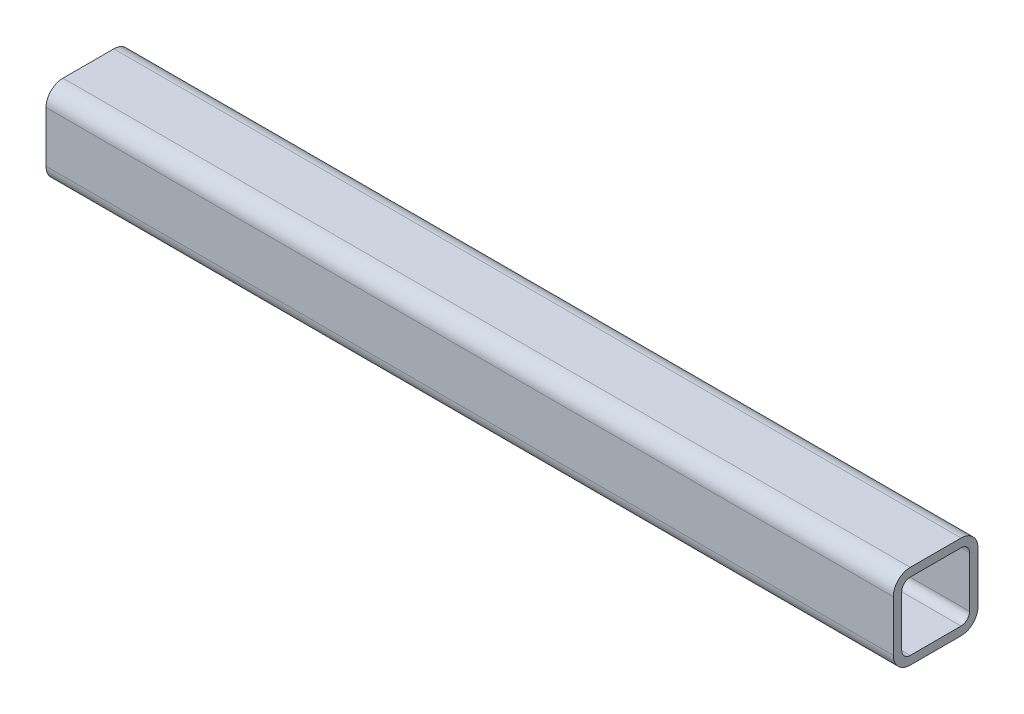
ISO-10303-21;
HEADER;
FILE_DESCRIPTION(('STEP AP214'),'2;1');
FILE_NAME('part.step','',(''),(''),'','','');
FILE_SCHEMA(('AUTOMOTIVE_DESIGN { 1 0 10303 214 1 1 1 1 }'));
ENDSEC;
DATA;
#1=APPLICATION_CONTEXT('core data for automotive mechanical design processes');
#2=APPLICATION_PROTOCOL_DEFINITION('international standard','automotive_design',2000,#1);
#3=PRODUCT_CONTEXT('',#1,'mechanical');
#4=PRODUCT('Part','Part','',(#3));
#5=PRODUCT_RELATED_PRODUCT_CATEGORY('part','',(#4));
#6=PRODUCT_DEFINITION_FORMATION('','',#4);
#7=PRODUCT_DEFINITION_CONTEXT('part definition',#1,'design');
#8=PRODUCT_DEFINITION('design','',#6,#7);
#9=PRODUCT_DEFINITION_SHAPE('','',#8);
#10=(LENGTH_UNIT() NAMED_UNIT(*) SI_UNIT(.MILLI.,.METRE.));
#11=(NAMED_UNIT(*) PLANE_ANGLE_UNIT() SI_UNIT($,.RADIAN.));
#12=(NAMED_UNIT(*) SI_UNIT($,.STERADIAN.) SOLID_ANGLE_UNIT());
#13=UNCERTAINTY_MEASURE_WITH_UNIT(LENGTH_MEASURE(1.E-05),#10,'distance_accuracy_value','');
#14=(GEOMETRIC_REPRESENTATION_CONTEXT(3) GLOBAL_UNCERTAINTY_ASSIGNED_CONTEXT((#13)) GLOBAL_UNIT_ASSIGNED_CONTEXT((#10,
#11,#12)) REPRESENTATION_CONTEXT('',''));
#15=CARTESIAN_POINT('',(0.,0.,0.));
#16=DIRECTION('',(0.,0.,1.));
#17=DIRECTION('',(1.,0.,0.));
#18=AXIS2_PLACEMENT_3D('',#15,#16,#17);
#19=CARTESIAN_POINT('',(99.9999999999993,-80.0000000000002,-559.));
#20=DIRECTION('',(1.,0.,0.));
#21=DIRECTION('',(0.,0.,-1.));
#22=AXIS2_PLACEMENT_3D('',#19,#20,#21);
#23=PLANE('',#22);
#24=DIRECTION('',(0.,1.,0.));
#25=VECTOR('',#24,1.);
#26=CARTESIAN_POINT('',(99.9999999999993,-86.,-560.));
#27=LINE('',#26,#25);
#28=CARTESIAN_POINT('',(99.9999999999993,-86.0000000000005,-560.));
#29=VERTEX_POINT('',#28);
#30=CARTESIAN_POINT('',(99.9999999999993,-74.0000000000005,-560.));
#31=VERTEX_POINT('',#30);
#32=EDGE_CURVE('E11',#29,#31,#27,.T.);
#33=ORIENTED_EDGE('',*,*,#32,.T.);
#34=CARTESIAN_POINT('',(99.9999999999993,-74.,-556.));
#35=DIRECTION('',(1.,0.,0.));
#36=DIRECTION('',(0.,0.,-1.));
#37=AXIS2_PLACEMENT_3D('',#34,#35,#36);
#38=CIRCLE('',#37,4.);
#39=CARTESIAN_POINT('',(99.9999999999993,-70.,-556.));
#40=VERTEX_POINT('',#39);
#41=EDGE_CURVE('E249',#31,#40,#38,.T.);
#42=ORIENTED_EDGE('',*,*,#41,.T.);
#43=DIRECTION('',(0.,0.,1.));
#44=VECTOR('',#43,1.);
#45=CARTESIAN_POINT('',(99.9999999999993,-70.,-544.));
#46=LINE('',#45,#44);
#47=CARTESIAN_POINT('',(99.9999999999993,-70.,-544.));
#48=VERTEX_POINT('',#47);
#49=EDGE_CURVE('E246',#40,#48,#46,.T.);
#50=ORIENTED_EDGE('',*,*,#49,.T.);
#51=CARTESIAN_POINT('',(99.9999999999993,-74.,-544.));
#52=DIRECTION('',(1.,0.,0.));
#53=DIRECTION('',(0.,0.,-1.));
#54=AXIS2_PLACEMENT_3D('',#51,#52,#53);
#55=CIRCLE('',#54,4.);
#56=CARTESIAN_POINT('',(99.9999999999993,-74.,-540.));
#57=VERTEX_POINT('',#56);
#58=EDGE_CURVE('E243',#48,#57,#55,.T.);
#59=ORIENTED_EDGE('',*,*,#58,.T.);
#60=DIRECTION('',(0.,-1.,0.));
#61=VECTOR('',#60,1.);
#62=CARTESIAN_POINT('',(99.9999999999993,-74.,-540.));
#63=LINE('',#62,#61);
#64=CARTESIAN_POINT('',(99.9999999999993,-86.,-540.));
#65=VERTEX_POINT('',#64);
#66=EDGE_CURVE('E240',#57,#65,#63,.T.);
#67=ORIENTED_EDGE('',*,*,#66,.T.);
#68=CARTESIAN_POINT('',(99.9999999999993,-86.,-544.));
#69=DIRECTION('',(1.,0.,0.));
#70=DIRECTION('',(0.,0.,-1.));
#71=AXIS2_PLACEMENT_3D('',#68,#69,#70);
#72=CIRCLE('',#71,4.);
#73=CARTESIAN_POINT('',(99.9999999999993,-90.,-544.));
#74=VERTEX_POINT('',#73);
#75=EDGE_CURVE('E237',#65,#74,#72,.T.);
#76=ORIENTED_EDGE('',*,*,#75,.T.);
#77=DIRECTION('',(0.,0.,-1.));
#78=VECTOR('',#77,1.);
#79=CARTESIAN_POINT('',(99.9999999999993,-90.,-556.));
#80=LINE('',#79,#78);
#81=CARTESIAN_POINT('',(99.9999999999993,-90.,-556.));
#82=VERTEX_POINT('',#81);
#83=EDGE_CURVE('E234',#74,#82,#80,.T.);
#84=ORIENTED_EDGE('',*,*,#83,.T.);
#85=CARTESIAN_POINT('',(99.9999999999993,-86.,-556.));
#86=DIRECTION('',(1.,0.,0.));
#87=DIRECTION('',(0.,0.,-1.));
#88=AXIS2_PLACEMENT_3D('',#85,#86,#87);
#89=CIRCLE('',#88,4.);
#90=EDGE_CURVE('E185',#82,#29,#89,.T.);
#91=ORIENTED_EDGE('',*,*,#90,.T.);
#92=EDGE_LOOP('',(#33,#42,#50,#59,#67,#76,#84,#91));
#93=FACE_BOUND('',#92,.T.);
#94=CARTESIAN_POINT('',(99.9999999999993,-74.,-556.));
#95=DIRECTION('',(1.,0.,0.));
#96=DIRECTION('',(0.,0.,-1.));
#97=AXIS2_PLACEMENT_3D('',#94,#95,#96);
#98=CIRCLE('',#97,2.);
#99=CARTESIAN_POINT('',(99.9999999999993,-74.,-558.));
#100=VERTEX_POINT('',#99);
#101=CARTESIAN_POINT('',(99.9999999999993,-72.,-556.));
#102=VERTEX_POINT('',#101);
#103=EDGE_CURVE('E217',#100,#102,#98,.T.);
#104=ORIENTED_EDGE('',*,*,#103,.F.);
#105=DIRECTION('',(0.,1.,0.));
#106=VECTOR('',#105,1.);
#107=CARTESIAN_POINT('',(99.9999999999993,-86.,-558.));
#108=LINE('',#107,#106);
#109=CARTESIAN_POINT('',(99.9999999999993,-86.0000000000005,-558.));
#110=VERTEX_POINT('',#109);
#111=EDGE_CURVE('E173',#110,#100,#108,.T.);
#112=ORIENTED_EDGE('',*,*,#111,.F.);
#113=CARTESIAN_POINT('',(99.9999999999993,-86.,-556.));
#114=DIRECTION('',(1.,0.,0.));
#115=DIRECTION('',(0.,0.,-1.));
#116=AXIS2_PLACEMENT_3D('',#113,#114,#115);
#117=CIRCLE('',#116,2.);
#118=CARTESIAN_POINT('',(99.9999999999993,-88.,-556.));
#119=VERTEX_POINT('',#118);
#120=EDGE_CURVE('E70',#119,#110,#117,.T.);
#121=ORIENTED_EDGE('',*,*,#120,.F.);
#122=DIRECTION('',(0.,0.,-1.));
#123=VECTOR('',#122,1.);
#124=CARTESIAN_POINT('',(99.9999999999993,-88.,-556.));
#125=LINE('',#124,#123);
#126=CARTESIAN_POINT('',(99.9999999999993,-88.,-544.));
#127=VERTEX_POINT('',#126);
#128=EDGE_CURVE('E82',#127,#119,#125,.T.);
#129=ORIENTED_EDGE('',*,*,#128,.F.);
#130=CARTESIAN_POINT('',(99.9999999999993,-86.,-544.));
#131=DIRECTION('',(1.,0.,0.));
#132=DIRECTION('',(0.,0.,-1.));
#133=AXIS2_PLACEMENT_3D('',#130,#131,#132);
#134=CIRCLE('',#133,2.);
#135=CARTESIAN_POINT('',(99.9999999999993,-86.,-542.));
#136=VERTEX_POINT('',#135);
#137=EDGE_CURVE('E222',#136,#127,#134,.T.);
#138=ORIENTED_EDGE('',*,*,#137,.F.);
#139=DIRECTION('',(0.,-1.,0.));
#140=VECTOR('',#139,1.);
#141=CARTESIAN_POINT('',(99.9999999999993,-74.,-542.));
#142=LINE('',#141,#140);
#143=CARTESIAN_POINT('',(99.9999999999993,-74.,-542.));
#144=VERTEX_POINT('',#143);
#145=EDGE_CURVE('E212',#144,#136,#142,.T.);
#146=ORIENTED_EDGE('',*,*,#145,.F.);
#147=CARTESIAN_POINT('',(99.9999999999993,-74.,-544.));
#148=DIRECTION('',(1.,0.,0.));
#149=DIRECTION('',(0.,0.,-1.));
#150=AXIS2_PLACEMENT_3D('',#147,#148,#149);
#151=CIRCLE('',#150,2.);
#152=CARTESIAN_POINT('',(99.9999999999993,-72.,-544.));
#153=VERTEX_POINT('',#152);
#154=EDGE_CURVE('E209',#153,#144,#151,.T.);
#155=ORIENTED_EDGE('',*,*,#154,.F.);
#156=DIRECTION('',(0.,0.,1.));
#157=VECTOR('',#156,1.);
#158=CARTESIAN_POINT('',(99.9999999999993,-72.,-544.));
#159=LINE('',#158,#157);
#160=EDGE_CURVE('E204',#102,#153,#159,.T.);
#161=ORIENTED_EDGE('',*,*,#160,.F.);
#162=EDGE_LOOP('',(#104,#112,#121,#129,#138,#146,#155,#161));
#163=FACE_BOUND('',#162,.T.);
#164=ADVANCED_FACE('F41',(#93,#163),#23,.T.);
#165=CARTESIAN_POINT('',(-100.,-74.0000000000004,-550.));
#166=DIRECTION('',(-1.,0.,0.));
#167=DIRECTION('',(0.,0.,1.));
#168=AXIS2_PLACEMENT_3D('',#165,#166,#167);
#169=PLANE('',#168);
#170=CARTESIAN_POINT('',(-100.,-74.,-556.));
#171=DIRECTION('',(-1.,0.,0.));
#172=DIRECTION('',(0.,0.,1.));
#173=AXIS2_PLACEMENT_3D('',#170,#171,#172);
#174=CIRCLE('',#173,4.);
#175=CARTESIAN_POINT('',(-100.,-70.,-556.));
#176=VERTEX_POINT('',#175);
#177=CARTESIAN_POINT('',(-100.,-74.0000000000004,-560.));
#178=VERTEX_POINT('',#177);
#179=EDGE_CURVE('E190',#176,#178,#174,.T.);
#180=ORIENTED_EDGE('',*,*,#179,.T.);
#181=DIRECTION('',(0.,-1.,0.));
#182=VECTOR('',#181,1.);
#183=CARTESIAN_POINT('',(-100.,-86.,-560.));
#184=LINE('',#183,#182);
#185=CARTESIAN_POINT('',(-100.,-86.0000000000004,-560.));
#186=VERTEX_POINT('',#185);
#187=EDGE_CURVE('E182',#178,#186,#184,.T.);
#188=ORIENTED_EDGE('',*,*,#187,.T.);
#189=CARTESIAN_POINT('',(-100.,-86.,-556.));
#190=DIRECTION('',(-1.,0.,0.));
#191=DIRECTION('',(0.,0.,1.));
#192=AXIS2_PLACEMENT_3D('',#189,#190,#191);
#193=CIRCLE('',#192,4.);
#194=CARTESIAN_POINT('',(-100.,-90.,-556.));
#195=VERTEX_POINT('',#194);
#196=EDGE_CURVE('E192',#186,#195,#193,.T.);
#197=ORIENTED_EDGE('',*,*,#196,.T.);
#198=DIRECTION('',(0.,0.,1.));
#199=VECTOR('',#198,1.);
#200=CARTESIAN_POINT('',(-100.,-90.,-556.));
#201=LINE('',#200,#199);
#202=CARTESIAN_POINT('',(-100.,-90.,-544.));
#203=VERTEX_POINT('',#202);
#204=EDGE_CURVE('E194',#195,#203,#201,.T.);
#205=ORIENTED_EDGE('',*,*,#204,.T.);
#206=CARTESIAN_POINT('',(-100.,-86.,-544.));
#207=DIRECTION('',(-1.,0.,0.));
#208=DIRECTION('',(0.,0.,1.));
#209=AXIS2_PLACEMENT_3D('',#206,#207,#208);
#210=CIRCLE('',#209,4.);
#211=CARTESIAN_POINT('',(-100.,-86.,-540.));
#212=VERTEX_POINT('',#211);
#213=EDGE_CURVE('E196',#203,#212,#210,.T.);
#214=ORIENTED_EDGE('',*,*,#213,.T.);
#215=DIRECTION('',(0.,1.,0.));
#216=VECTOR('',#215,1.);
#217=CARTESIAN_POINT('',(-100.,-74.,-540.));
#218=LINE('',#217,#216);
#219=CARTESIAN_POINT('',(-100.,-74.,-540.));
#220=VERTEX_POINT('',#219);
#221=EDGE_CURVE('E184',#212,#220,#218,.T.);
#222=ORIENTED_EDGE('',*,*,#221,.T.);
#223=CARTESIAN_POINT('',(-100.,-74.,-544.));
#224=DIRECTION('',(-1.,0.,0.));
#225=DIRECTION('',(0.,0.,1.));
#226=AXIS2_PLACEMENT_3D('',#223,#224,#225);
#227=CIRCLE('',#226,4.);
#228=CARTESIAN_POINT('',(-100.,-70.,-544.));
#229=VERTEX_POINT('',#228);
#230=EDGE_CURVE('E186',#220,#229,#227,.T.);
#231=ORIENTED_EDGE('',*,*,#230,.T.);
#232=DIRECTION('',(0.,0.,-1.));
#233=VECTOR('',#232,1.);
#234=CARTESIAN_POINT('',(-100.,-70.,-544.));
#235=LINE('',#234,#233);
#236=EDGE_CURVE('E188',#229,#176,#235,.T.);
#237=ORIENTED_EDGE('',*,*,#236,.T.);
#238=EDGE_LOOP('',(#180,#188,#197,#205,#214,#222,#231,#237));
#239=FACE_BOUND('',#238,.T.);
#240=DIRECTION('',(0.,-1.,0.));
#241=VECTOR('',#240,1.);
#242=CARTESIAN_POINT('',(-100.,-86.,-558.));
#243=LINE('',#242,#241);
#244=CARTESIAN_POINT('',(-100.,-74.0000000000004,-558.));
#245=VERTEX_POINT('',#244);
#246=CARTESIAN_POINT('',(-100.,-86.,-558.));
#247=VERTEX_POINT('',#246);
#248=EDGE_CURVE('E163',#245,#247,#243,.T.);
#249=ORIENTED_EDGE('',*,*,#248,.F.);
#250=CARTESIAN_POINT('',(-100.,-74.,-556.));
#251=DIRECTION('',(-1.,0.,0.));
#252=DIRECTION('',(0.,0.,1.));
#253=AXIS2_PLACEMENT_3D('',#250,#251,#252);
#254=CIRCLE('',#253,2.);
#255=CARTESIAN_POINT('',(-100.,-72.,-556.));
#256=VERTEX_POINT('',#255);
#257=EDGE_CURVE('E213',#256,#245,#254,.T.);
#258=ORIENTED_EDGE('',*,*,#257,.F.);
#259=DIRECTION('',(0.,0.,-1.));
#260=VECTOR('',#259,1.);
#261=CARTESIAN_POINT('',(-100.,-72.,-544.));
#262=LINE('',#261,#260);
#263=CARTESIAN_POINT('',(-100.,-72.,-544.));
#264=VERTEX_POINT('',#263);
#265=EDGE_CURVE('E200',#264,#256,#262,.T.);
#266=ORIENTED_EDGE('',*,*,#265,.F.);
#267=CARTESIAN_POINT('',(-100.,-74.,-544.));
#268=DIRECTION('',(-1.,0.,0.));
#269=DIRECTION('',(0.,0.,1.));
#270=AXIS2_PLACEMENT_3D('',#267,#268,#269);
#271=CIRCLE('',#270,2.);
#272=CARTESIAN_POINT('',(-100.,-74.,-542.));
#273=VERTEX_POINT('',#272);
#274=EDGE_CURVE('E205',#273,#264,#271,.T.);
#275=ORIENTED_EDGE('',*,*,#274,.F.);
#276=DIRECTION('',(0.,1.,0.));
#277=VECTOR('',#276,1.);
#278=CARTESIAN_POINT('',(-100.,-74.,-542.));
#279=LINE('',#278,#277);
#280=CARTESIAN_POINT('',(-100.,-86.,-542.));
#281=VERTEX_POINT('',#280);
#282=EDGE_CURVE('E174',#281,#273,#279,.T.);
#283=ORIENTED_EDGE('',*,*,#282,.F.);
#284=CARTESIAN_POINT('',(-100.,-86.,-544.));
#285=DIRECTION('',(-1.,0.,0.));
#286=DIRECTION('',(0.,0.,1.));
#287=AXIS2_PLACEMENT_3D('',#284,#285,#286);
#288=CIRCLE('',#287,2.);
#289=CARTESIAN_POINT('',(-100.,-88.,-544.));
#290=VERTEX_POINT('',#289);
#291=EDGE_CURVE('E218',#290,#281,#288,.T.);
#292=ORIENTED_EDGE('',*,*,#291,.F.);
#293=DIRECTION('',(0.,0.,1.));
#294=VECTOR('',#293,1.);
#295=CARTESIAN_POINT('',(-100.,-88.,-556.));
#296=LINE('',#295,#294);
#297=CARTESIAN_POINT('',(-100.,-88.,-556.));
#298=VERTEX_POINT('',#297);
#299=EDGE_CURVE('E166',#298,#290,#296,.T.);
#300=ORIENTED_EDGE('',*,*,#299,.F.);
#301=CARTESIAN_POINT('',(-100.,-86.,-556.));
#302=DIRECTION('',(-1.,0.,0.));
#303=DIRECTION('',(0.,0.,1.));
#304=AXIS2_PLACEMENT_3D('',#301,#302,#303);
#305=CIRCLE('',#304,2.);
#306=EDGE_CURVE('E160',#247,#298,#305,.T.);
#307=ORIENTED_EDGE('',*,*,#306,.F.);
#308=EDGE_LOOP('',(#249,#258,#266,#275,#283,#292,#300,#307));
#309=FACE_BOUND('',#308,.T.);
#310=ADVANCED_FACE('F161',(#239,#309),#169,.T.);
#311=CARTESIAN_POINT('',(-110.,-86.,-544.));
#312=DIRECTION('',(1.,0.,0.));
#313=DIRECTION('',(0.,0.,-1.));
#314=AXIS2_PLACEMENT_3D('',#311,#312,#313);
#315=CYLINDRICAL_SURFACE('',#314,2.);
#316=DIRECTION('',(1.,0.,0.));
#317=VECTOR('',#316,1.);
#318=CARTESIAN_POINT('',(-110.,-86.,-542.));
#319=LINE('',#318,#317);
#320=EDGE_CURVE('E198',#281,#136,#319,.T.);
#321=ORIENTED_EDGE('',*,*,#320,.T.);
#322=ORIENTED_EDGE('',*,*,#137,.T.);
#323=DIRECTION('',(1.,0.,0.));
#324=VECTOR('',#323,1.);
#325=CARTESIAN_POINT('',(-110.,-88.,-544.));
#326=LINE('',#325,#324);
#327=EDGE_CURVE('E221',#290,#127,#326,.T.);
#328=ORIENTED_EDGE('',*,*,#327,.F.);
#329=ORIENTED_EDGE('',*,*,#291,.T.);
#330=EDGE_LOOP('',(#321,#322,#328,#329));
#331=FACE_BOUND('',#330,.T.);
#332=ADVANCED_FACE('F299',(#331),#315,.F.);
#333=CARTESIAN_POINT('',(-110.,-88.,-556.));
#334=DIRECTION('',(0.,1.,0.));
#335=DIRECTION('',(0.,0.,1.));
#336=AXIS2_PLACEMENT_3D('',#333,#334,#335);
#337=PLANE('',#336);
#338=ORIENTED_EDGE('',*,*,#327,.T.);
#339=ORIENTED_EDGE('',*,*,#128,.T.);
#340=DIRECTION('',(1.,0.,0.));
#341=VECTOR('',#340,1.);
#342=CARTESIAN_POINT('',(-110.,-88.,-556.));
#343=LINE('',#342,#341);
#344=EDGE_CURVE('E223',#298,#119,#343,.T.);
#345=ORIENTED_EDGE('',*,*,#344,.F.);
#346=ORIENTED_EDGE('',*,*,#299,.T.);
#347=EDGE_LOOP('',(#338,#339,#345,#346));
#348=FACE_BOUND('',#347,.T.);
#349=ADVANCED_FACE('F300',(#348),#337,.T.);
#350=CARTESIAN_POINT('',(-110.,-86.,-556.));
#351=DIRECTION('',(1.,0.,0.));
#352=DIRECTION('',(0.,0.,-1.));
#353=AXIS2_PLACEMENT_3D('',#350,#351,#352);
#354=CYLINDRICAL_SURFACE('',#353,2.);
#355=ORIENTED_EDGE('',*,*,#344,.T.);
#356=ORIENTED_EDGE('',*,*,#120,.T.);
#357=DIRECTION('',(1.,0.,0.));
#358=VECTOR('',#357,1.);
#359=CARTESIAN_POINT('',(-110.,-86.,-558.));
#360=LINE('',#359,#358);
#361=EDGE_CURVE('E169',#247,#110,#360,.T.);
#362=ORIENTED_EDGE('',*,*,#361,.F.);
#363=ORIENTED_EDGE('',*,*,#306,.T.);
#364=EDGE_LOOP('',(#355,#356,#362,#363));
#365=FACE_BOUND('',#364,.T.);
#366=ADVANCED_FACE('F170',(#365),#354,.F.);
#367=CARTESIAN_POINT('',(-110.,-74.,-556.));
#368=DIRECTION('',(1.,0.,0.));
#369=DIRECTION('',(0.,0.,-1.));
#370=AXIS2_PLACEMENT_3D('',#367,#368,#369);
#371=CYLINDRICAL_SURFACE('',#370,2.);
#372=DIRECTION('',(1.,0.,0.));
#373=VECTOR('',#372,1.);
#374=CARTESIAN_POINT('',(-110.,-74.,-558.));
#375=LINE('',#374,#373);
#376=EDGE_CURVE('E44',#245,#100,#375,.T.);
#377=ORIENTED_EDGE('',*,*,#376,.T.);
#378=ORIENTED_EDGE('',*,*,#103,.T.);
#379=DIRECTION('',(1.,0.,0.));
#380=VECTOR('',#379,1.);
#381=CARTESIAN_POINT('',(-110.,-72.,-556.));
#382=LINE('',#381,#380);
#383=EDGE_CURVE('E216',#256,#102,#382,.T.);
#384=ORIENTED_EDGE('',*,*,#383,.F.);
#385=ORIENTED_EDGE('',*,*,#257,.T.);
#386=EDGE_LOOP('',(#377,#378,#384,#385));
#387=FACE_BOUND('',#386,.T.);
#388=ADVANCED_FACE('F286',(#387),#371,.F.);
#389=CARTESIAN_POINT('',(-110.,-72.,-544.));
#390=DIRECTION('',(0.,-1.,0.));
#391=DIRECTION('',(0.,0.,-1.));
#392=AXIS2_PLACEMENT_3D('',#389,#390,#391);
#393=PLANE('',#392);
#394=ORIENTED_EDGE('',*,*,#383,.T.);
#395=ORIENTED_EDGE('',*,*,#160,.T.);
#396=DIRECTION('',(1.,0.,0.));
#397=VECTOR('',#396,1.);
#398=CARTESIAN_POINT('',(-110.,-72.,-544.));
#399=LINE('',#398,#397);
#400=EDGE_CURVE('E203',#264,#153,#399,.T.);
#401=ORIENTED_EDGE('',*,*,#400,.F.);
#402=ORIENTED_EDGE('',*,*,#265,.T.);
#403=EDGE_LOOP('',(#394,#395,#401,#402));
#404=FACE_BOUND('',#403,.T.);
#405=ADVANCED_FACE('F288',(#404),#393,.T.);
#406=CARTESIAN_POINT('',(-110.,-74.,-544.));
#407=DIRECTION('',(1.,0.,0.));
#408=DIRECTION('',(0.,0.,-1.));
#409=AXIS2_PLACEMENT_3D('',#406,#407,#408);
#410=CYLINDRICAL_SURFACE('',#409,2.);
#411=ORIENTED_EDGE('',*,*,#400,.T.);
#412=ORIENTED_EDGE('',*,*,#154,.T.);
#413=DIRECTION('',(1.,0.,0.));
#414=VECTOR('',#413,1.);
#415=CARTESIAN_POINT('',(-110.,-74.,-542.));
#416=LINE('',#415,#414);
#417=EDGE_CURVE('E208',#273,#144,#416,.T.);
#418=ORIENTED_EDGE('',*,*,#417,.F.);
#419=ORIENTED_EDGE('',*,*,#274,.T.);
#420=EDGE_LOOP('',(#411,#412,#418,#419));
#421=FACE_BOUND('',#420,.T.);
#422=ADVANCED_FACE('F293',(#421),#410,.F.);
#423=CARTESIAN_POINT('',(-110.,-74.,-542.));
#424=DIRECTION('',(0.,0.,-1.));
#425=DIRECTION('',(-1.,0.,0.));
#426=AXIS2_PLACEMENT_3D('',#423,#424,#425);
#427=PLANE('',#426);
#428=ORIENTED_EDGE('',*,*,#417,.T.);
#429=ORIENTED_EDGE('',*,*,#145,.T.);
#430=ORIENTED_EDGE('',*,*,#320,.F.);
#431=ORIENTED_EDGE('',*,*,#282,.T.);
#432=EDGE_LOOP('',(#428,#429,#430,#431));
#433=FACE_BOUND('',#432,.T.);
#434=ADVANCED_FACE('F296',(#433),#427,.T.);
#435=CARTESIAN_POINT('',(-110.,-86.,-558.));
#436=DIRECTION('',(0.,0.,1.));
#437=DIRECTION('',(1.,0.,0.));
#438=AXIS2_PLACEMENT_3D('',#435,#436,#437);
#439=PLANE('',#438);
#440=ORIENTED_EDGE('',*,*,#361,.T.);
#441=ORIENTED_EDGE('',*,*,#111,.T.);
#442=ORIENTED_EDGE('',*,*,#376,.F.);
#443=ORIENTED_EDGE('',*,*,#248,.T.);
#444=EDGE_LOOP('',(#440,#441,#442,#443));
#445=FACE_BOUND('',#444,.T.);
#446=ADVANCED_FACE('F175',(#445),#439,.T.);
#447=CARTESIAN_POINT('',(-110.,-86.,-556.));
#448=DIRECTION('',(1.,0.,0.));
#449=DIRECTION('',(0.,0.,-1.));
#450=AXIS2_PLACEMENT_3D('',#447,#448,#449);
#451=CYLINDRICAL_SURFACE('',#450,4.);
#452=ORIENTED_EDGE('',*,*,#90,.F.);
#453=DIRECTION('',(1.,0.,0.));
#454=VECTOR('',#453,1.);
#455=CARTESIAN_POINT('',(-110.,-90.,-556.));
#456=LINE('',#455,#454);
#457=EDGE_CURVE('E256',#195,#82,#456,.T.);
#458=ORIENTED_EDGE('',*,*,#457,.F.);
#459=ORIENTED_EDGE('',*,*,#196,.F.);
#460=DIRECTION('',(1.,0.,0.));
#461=VECTOR('',#460,1.);
#462=CARTESIAN_POINT('',(-110.,-86.,-560.));
#463=LINE('',#462,#461);
#464=EDGE_CURVE('E176',#186,#29,#463,.T.);
#465=ORIENTED_EDGE('',*,*,#464,.T.);
#466=EDGE_LOOP('',(#452,#458,#459,#465));
#467=FACE_BOUND('',#466,.T.);
#468=ADVANCED_FACE('F348',(#467),#451,.T.);
#469=CARTESIAN_POINT('',(-110.,-86.,-544.));
#470=DIRECTION('',(1.,0.,0.));
#471=DIRECTION('',(0.,0.,-1.));
#472=AXIS2_PLACEMENT_3D('',#469,#470,#471);
#473=CYLINDRICAL_SURFACE('',#472,4.);
#474=ORIENTED_EDGE('',*,*,#75,.F.);
#475=DIRECTION('',(1.,0.,0.));
#476=VECTOR('',#475,1.);
#477=CARTESIAN_POINT('',(-110.,-86.,-540.));
#478=LINE('',#477,#476);
#479=EDGE_CURVE('E265',#212,#65,#478,.T.);
#480=ORIENTED_EDGE('',*,*,#479,.F.);
#481=ORIENTED_EDGE('',*,*,#213,.F.);
#482=DIRECTION('',(1.,0.,0.));
#483=VECTOR('',#482,1.);
#484=CARTESIAN_POINT('',(-110.,-90.,-544.));
#485=LINE('',#484,#483);
#486=EDGE_CURVE('E178',#203,#74,#485,.T.);
#487=ORIENTED_EDGE('',*,*,#486,.T.);
#488=EDGE_LOOP('',(#474,#480,#481,#487));
#489=FACE_BOUND('',#488,.T.);
#490=ADVANCED_FACE('F340',(#489),#473,.T.);
#491=CARTESIAN_POINT('',(-110.,-74.,-540.));
#492=DIRECTION('',(0.,0.,-1.));
#493=DIRECTION('',(-1.,0.,0.));
#494=AXIS2_PLACEMENT_3D('',#491,#492,#493);
#495=PLANE('',#494);
#496=ORIENTED_EDGE('',*,*,#66,.F.);
#497=DIRECTION('',(1.,0.,0.));
#498=VECTOR('',#497,1.);
#499=CARTESIAN_POINT('',(-110.,-74.,-540.));
#500=LINE('',#499,#498);
#501=EDGE_CURVE('E262',#220,#57,#500,.T.);
#502=ORIENTED_EDGE('',*,*,#501,.F.);
#503=ORIENTED_EDGE('',*,*,#221,.F.);
#504=ORIENTED_EDGE('',*,*,#479,.T.);
#505=EDGE_LOOP('',(#496,#502,#503,#504));
#506=FACE_BOUND('',#505,.T.);
#507=ADVANCED_FACE('F336',(#506),#495,.F.);
#508=CARTESIAN_POINT('',(-110.,-74.,-544.));
#509=DIRECTION('',(1.,0.,0.));
#510=DIRECTION('',(0.,0.,-1.));
#511=AXIS2_PLACEMENT_3D('',#508,#509,#510);
#512=CYLINDRICAL_SURFACE('',#511,4.);
#513=ORIENTED_EDGE('',*,*,#58,.F.);
#514=DIRECTION('',(1.,0.,0.));
#515=VECTOR('',#514,1.);
#516=CARTESIAN_POINT('',(-110.,-70.,-544.));
#517=LINE('',#516,#515);
#518=EDGE_CURVE('E252',#229,#48,#517,.T.);
#519=ORIENTED_EDGE('',*,*,#518,.F.);
#520=ORIENTED_EDGE('',*,*,#230,.F.);
#521=ORIENTED_EDGE('',*,*,#501,.T.);
#522=EDGE_LOOP('',(#513,#519,#520,#521));
#523=FACE_BOUND('',#522,.T.);
#524=ADVANCED_FACE('F331',(#523),#512,.T.);
#525=CARTESIAN_POINT('',(-110.,-90.,-556.));
#526=DIRECTION('',(0.,1.,0.));
#527=DIRECTION('',(0.,0.,1.));
#528=AXIS2_PLACEMENT_3D('',#525,#526,#527);
#529=PLANE('',#528);
#530=ORIENTED_EDGE('',*,*,#83,.F.);
#531=ORIENTED_EDGE('',*,*,#486,.F.);
#532=ORIENTED_EDGE('',*,*,#204,.F.);
#533=ORIENTED_EDGE('',*,*,#457,.T.);
#534=EDGE_LOOP('',(#530,#531,#532,#533));
#535=FACE_BOUND('',#534,.T.);
#536=ADVANCED_FACE('F343',(#535),#529,.F.);
#537=CARTESIAN_POINT('',(-110.,-70.,-544.));
#538=DIRECTION('',(0.,-1.,0.));
#539=DIRECTION('',(0.,0.,-1.));
#540=AXIS2_PLACEMENT_3D('',#537,#538,#539);
#541=PLANE('',#540);
#542=ORIENTED_EDGE('',*,*,#49,.F.);
#543=DIRECTION('',(1.,0.,0.));
#544=VECTOR('',#543,1.);
#545=CARTESIAN_POINT('',(-110.,-70.,-556.));
#546=LINE('',#545,#544);
#547=EDGE_CURVE('E255',#176,#40,#546,.T.);
#548=ORIENTED_EDGE('',*,*,#547,.F.);
#549=ORIENTED_EDGE('',*,*,#236,.F.);
#550=ORIENTED_EDGE('',*,*,#518,.T.);
#551=EDGE_LOOP('',(#542,#548,#549,#550));
#552=FACE_BOUND('',#551,.T.);
#553=ADVANCED_FACE('F328',(#552),#541,.F.);
#554=CARTESIAN_POINT('',(-110.,-74.,-556.));
#555=DIRECTION('',(1.,0.,0.));
#556=DIRECTION('',(0.,0.,-1.));
#557=AXIS2_PLACEMENT_3D('',#554,#555,#556);
#558=CYLINDRICAL_SURFACE('',#557,4.);
#559=ORIENTED_EDGE('',*,*,#41,.F.);
#560=DIRECTION('',(1.,0.,0.));
#561=VECTOR('',#560,1.);
#562=CARTESIAN_POINT('',(-110.,-74.,-560.));
#563=LINE('',#562,#561);
#564=EDGE_CURVE('E50',#178,#31,#563,.T.);
#565=ORIENTED_EDGE('',*,*,#564,.F.);
#566=ORIENTED_EDGE('',*,*,#179,.F.);
#567=ORIENTED_EDGE('',*,*,#547,.T.);
#568=EDGE_LOOP('',(#559,#565,#566,#567));
#569=FACE_BOUND('',#568,.T.);
#570=ADVANCED_FACE('F322',(#569),#558,.T.);
#571=CARTESIAN_POINT('',(-110.,-86.,-560.));
#572=DIRECTION('',(0.,0.,1.));
#573=DIRECTION('',(1.,0.,0.));
#574=AXIS2_PLACEMENT_3D('',#571,#572,#573);
#575=PLANE('',#574);
#576=ORIENTED_EDGE('',*,*,#32,.F.);
#577=ORIENTED_EDGE('',*,*,#464,.F.);
#578=ORIENTED_EDGE('',*,*,#187,.F.);
#579=ORIENTED_EDGE('',*,*,#564,.T.);
#580=EDGE_LOOP('',(#576,#577,#578,#579));
#581=FACE_BOUND('',#580,.T.);
#582=ADVANCED_FACE('F349',(#581),#575,.F.);
#583=CLOSED_SHELL('',(#164,#310,#332,#349,#366,#388,#405,#422,#434,#446,#468,#490,#507,#524,
#536,#553,#570,#582));
#584=MANIFOLD_SOLID_BREP('B2',#583);
#585=ADVANCED_BREP_SHAPE_REPRESENTATION('',(#18,#584),#14);
#586=SHAPE_DEFINITION_REPRESENTATION(#9,#585);
ENDSEC;
END-ISO-10303-21;
